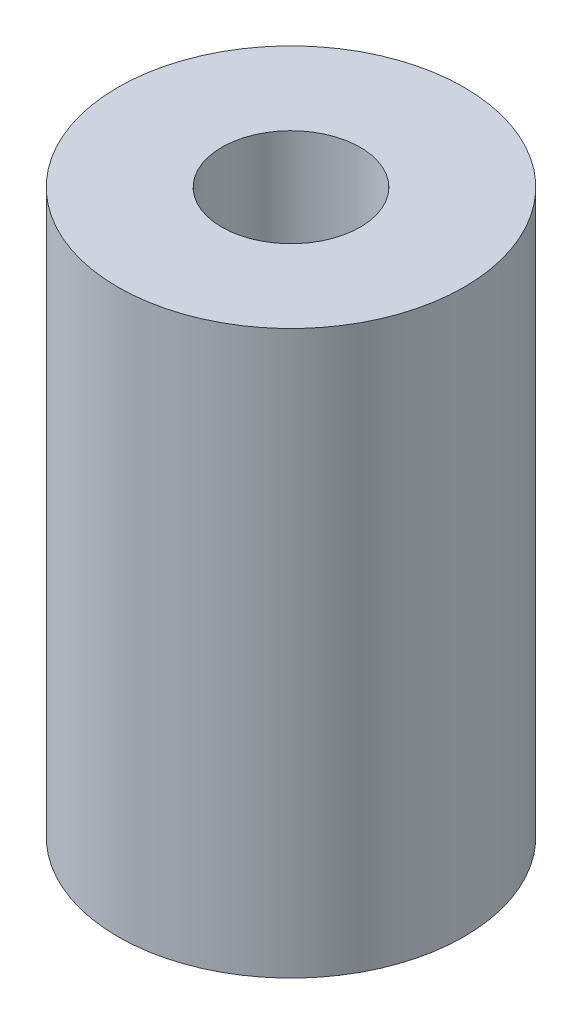
ISO-10303-21;
HEADER;
FILE_DESCRIPTION(('STEP AP214'),'2;1');
FILE_NAME('part.step','',(''),(''),'','','');
FILE_SCHEMA(('AUTOMOTIVE_DESIGN { 1 0 10303 214 1 1 1 1 }'));
ENDSEC;
DATA;
#1=APPLICATION_CONTEXT('core data for automotive mechanical design processes');
#2=APPLICATION_PROTOCOL_DEFINITION('international standard','automotive_design',2000,#1);
#3=PRODUCT_CONTEXT('',#1,'mechanical');
#4=PRODUCT('Part','Part','',(#3));
#5=PRODUCT_RELATED_PRODUCT_CATEGORY('part','',(#4));
#6=PRODUCT_DEFINITION_FORMATION('','',#4);
#7=PRODUCT_DEFINITION_CONTEXT('part definition',#1,'design');
#8=PRODUCT_DEFINITION('design','',#6,#7);
#9=PRODUCT_DEFINITION_SHAPE('','',#8);
#10=(LENGTH_UNIT() NAMED_UNIT(*) SI_UNIT(.MILLI.,.METRE.));
#11=(NAMED_UNIT(*) PLANE_ANGLE_UNIT() SI_UNIT($,.RADIAN.));
#12=(NAMED_UNIT(*) SI_UNIT($,.STERADIAN.) SOLID_ANGLE_UNIT());
#13=UNCERTAINTY_MEASURE_WITH_UNIT(LENGTH_MEASURE(1.E-05),#10,'distance_accuracy_value','');
#14=(GEOMETRIC_REPRESENTATION_CONTEXT(3) GLOBAL_UNCERTAINTY_ASSIGNED_CONTEXT((#13)) GLOBAL_UNIT_ASSIGNED_CONTEXT((#10,
#11,#12)) REPRESENTATION_CONTEXT('',''));
#15=CARTESIAN_POINT('',(0.,0.,0.));
#16=DIRECTION('',(0.,0.,1.));
#17=DIRECTION('',(1.,0.,0.));
#18=AXIS2_PLACEMENT_3D('',#15,#16,#17);
#19=CARTESIAN_POINT('',(0.,15.,0.));
#20=DIRECTION('',(0.,1.,0.));
#21=DIRECTION('',(0.,0.,1.));
#22=AXIS2_PLACEMENT_3D('',#19,#20,#21);
#23=PLANE('',#22);
#24=CARTESIAN_POINT('',(0.,15.,0.));
#25=DIRECTION('',(0.,1.,0.));
#26=DIRECTION('',(0.,0.,1.));
#27=AXIS2_PLACEMENT_3D('',#24,#25,#26);
#28=CIRCLE('',#27,2.5);
#29=CARTESIAN_POINT('',(0.,15.,2.5));
#30=VERTEX_POINT('',#29);
#31=EDGE_CURVE('E49',#30,#30,#28,.T.);
#32=ORIENTED_EDGE('',*,*,#31,.F.);
#33=EDGE_LOOP('',(#32));
#34=FACE_BOUND('',#33,.T.);
#35=CARTESIAN_POINT('',(0.,15.,0.));
#36=DIRECTION('',(0.,1.,0.));
#37=DIRECTION('',(0.,0.,1.));
#38=AXIS2_PLACEMENT_3D('',#35,#36,#37);
#39=CIRCLE('',#38,4.);
#40=CARTESIAN_POINT('',(0.,15.,4.));
#41=VERTEX_POINT('',#40);
#42=EDGE_CURVE('E66',#41,#41,#39,.T.);
#43=ORIENTED_EDGE('',*,*,#42,.T.);
#44=EDGE_LOOP('',(#43));
#45=FACE_BOUND('',#44,.T.);
#46=ADVANCED_FACE('F41',(#34,#45),#23,.T.);
#47=CARTESIAN_POINT('',(0.,0.,0.));
#48=DIRECTION('',(0.,1.,0.));
#49=DIRECTION('',(0.,0.,1.));
#50=AXIS2_PLACEMENT_3D('',#47,#48,#49);
#51=PLANE('',#50);
#52=CARTESIAN_POINT('',(0.,0.,0.));
#53=DIRECTION('',(0.,1.,0.));
#54=DIRECTION('',(0.,0.,1.));
#55=AXIS2_PLACEMENT_3D('',#52,#53,#54);
#56=CIRCLE('',#55,10.);
#57=CARTESIAN_POINT('',(0.,0.,10.));
#58=VERTEX_POINT('',#57);
#59=EDGE_CURVE('E10',#58,#58,#56,.T.);
#60=ORIENTED_EDGE('',*,*,#59,.F.);
#61=EDGE_LOOP('',(#60));
#62=FACE_BOUND('',#61,.T.);
#63=CARTESIAN_POINT('',(0.,0.,0.));
#64=DIRECTION('',(0.,1.,0.));
#65=DIRECTION('',(0.,0.,1.));
#66=AXIS2_PLACEMENT_3D('',#63,#64,#65);
#67=CIRCLE('',#66,2.5);
#68=CARTESIAN_POINT('',(0.,0.,2.5));
#69=VERTEX_POINT('',#68);
#70=EDGE_CURVE('E54',#69,#69,#67,.T.);
#71=ORIENTED_EDGE('',*,*,#70,.T.);
#72=EDGE_LOOP('',(#71));
#73=FACE_BOUND('',#72,.T.);
#74=ADVANCED_FACE('F89',(#62,#73),#51,.F.);
#75=CARTESIAN_POINT('',(0.,15.,0.));
#76=DIRECTION('',(0.,-1.,0.));
#77=DIRECTION('',(0.,0.,-1.));
#78=AXIS2_PLACEMENT_3D('',#75,#76,#77);
#79=CYLINDRICAL_SURFACE('',#78,10.);
#80=ORIENTED_EDGE('',*,*,#59,.T.);
#81=EDGE_LOOP('',(#80));
#82=FACE_BOUND('',#81,.T.);
#83=CARTESIAN_POINT('',(0.,32.5,0.));
#84=DIRECTION('',(0.,1.,0.));
#85=DIRECTION('',(0.,0.,1.));
#86=AXIS2_PLACEMENT_3D('',#83,#84,#85);
#87=CIRCLE('',#86,10.);
#88=CARTESIAN_POINT('',(0.,32.5,10.));
#89=VERTEX_POINT('',#88);
#90=EDGE_CURVE('E60',#89,#89,#87,.T.);
#91=ORIENTED_EDGE('',*,*,#90,.F.);
#92=EDGE_LOOP('',(#91));
#93=FACE_BOUND('',#92,.T.);
#94=ADVANCED_FACE('F43',(#82,#93),#79,.T.);
#95=CARTESIAN_POINT('',(0.,15.,0.));
#96=DIRECTION('',(0.,-1.,0.));
#97=DIRECTION('',(0.,0.,-1.));
#98=AXIS2_PLACEMENT_3D('',#95,#96,#97);
#99=CYLINDRICAL_SURFACE('',#98,2.5);
#100=ORIENTED_EDGE('',*,*,#31,.T.);
#101=EDGE_LOOP('',(#100));
#102=FACE_BOUND('',#101,.T.);
#103=ORIENTED_EDGE('',*,*,#70,.F.);
#104=EDGE_LOOP('',(#103));
#105=FACE_BOUND('',#104,.T.);
#106=ADVANCED_FACE('F79',(#102,#105),#99,.F.);
#107=CARTESIAN_POINT('',(0.,32.5,0.));
#108=DIRECTION('',(0.,1.,0.));
#109=DIRECTION('',(0.,0.,1.));
#110=AXIS2_PLACEMENT_3D('',#107,#108,#109);
#111=PLANE('',#110);
#112=ORIENTED_EDGE('',*,*,#90,.T.);
#113=EDGE_LOOP('',(#112));
#114=FACE_BOUND('',#113,.T.);
#115=CARTESIAN_POINT('',(0.,32.5,0.));
#116=DIRECTION('',(0.,1.,0.));
#117=DIRECTION('',(0.,0.,1.));
#118=AXIS2_PLACEMENT_3D('',#115,#116,#117);
#119=CIRCLE('',#118,4.);
#120=CARTESIAN_POINT('',(0.,32.5,4.));
#121=VERTEX_POINT('',#120);
#122=EDGE_CURVE('E65',#121,#121,#119,.T.);
#123=ORIENTED_EDGE('',*,*,#122,.F.);
#124=EDGE_LOOP('',(#123));
#125=FACE_BOUND('',#124,.T.);
#126=ADVANCED_FACE('F77',(#114,#125),#111,.T.);
#127=CARTESIAN_POINT('',(0.,32.5,0.));
#128=DIRECTION('',(0.,-1.,0.));
#129=DIRECTION('',(0.,0.,-1.));
#130=AXIS2_PLACEMENT_3D('',#127,#128,#129);
#131=CYLINDRICAL_SURFACE('',#130,4.);
#132=ORIENTED_EDGE('',*,*,#122,.T.);
#133=EDGE_LOOP('',(#132));
#134=FACE_BOUND('',#133,.T.);
#135=ORIENTED_EDGE('',*,*,#42,.F.);
#136=EDGE_LOOP('',(#135));
#137=FACE_BOUND('',#136,.T.);
#138=ADVANCED_FACE('F74',(#134,#137),#131,.F.);
#139=CLOSED_SHELL('',(#46,#74,#94,#106,#126,#138));
#140=MANIFOLD_SOLID_BREP('B2',#139);
#141=ADVANCED_BREP_SHAPE_REPRESENTATION('',(#18,#140),#14);
#142=SHAPE_DEFINITION_REPRESENTATION(#9,#141);
ENDSEC;
END-ISO-10303-21;
